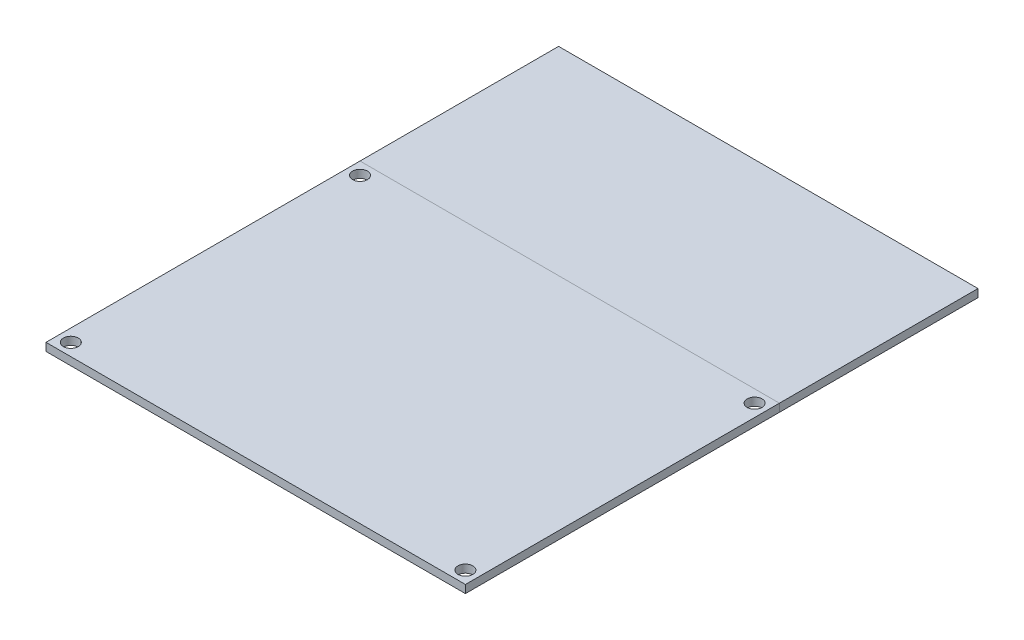
ISO-10303-21;
HEADER;
FILE_DESCRIPTION(('STEP AP214'),'2;1');
FILE_NAME('part.step','',(''),(''),'','','');
FILE_SCHEMA(('AUTOMOTIVE_DESIGN { 1 0 10303 214 1 1 1 1 }'));
ENDSEC;
DATA;
#1=APPLICATION_CONTEXT('core data for automotive mechanical design processes');
#2=APPLICATION_PROTOCOL_DEFINITION('international standard','automotive_design',2000,#1);
#3=PRODUCT_CONTEXT('',#1,'mechanical');
#4=PRODUCT('Part','Part','',(#3));
#5=PRODUCT_RELATED_PRODUCT_CATEGORY('part','',(#4));
#6=PRODUCT_DEFINITION_FORMATION('','',#4);
#7=PRODUCT_DEFINITION_CONTEXT('part definition',#1,'design');
#8=PRODUCT_DEFINITION('design','',#6,#7);
#9=PRODUCT_DEFINITION_SHAPE('','',#8);
#10=(LENGTH_UNIT() NAMED_UNIT(*) SI_UNIT(.MILLI.,.METRE.));
#11=(NAMED_UNIT(*) PLANE_ANGLE_UNIT() SI_UNIT($,.RADIAN.));
#12=(NAMED_UNIT(*) SI_UNIT($,.STERADIAN.) SOLID_ANGLE_UNIT());
#13=UNCERTAINTY_MEASURE_WITH_UNIT(LENGTH_MEASURE(1.E-05),#10,'distance_accuracy_value','');
#14=(GEOMETRIC_REPRESENTATION_CONTEXT(3) GLOBAL_UNCERTAINTY_ASSIGNED_CONTEXT((#13)) GLOBAL_UNIT_ASSIGNED_CONTEXT((#10,
#11,#12)) REPRESENTATION_CONTEXT('',''));
#15=CARTESIAN_POINT('',(0.,0.,0.));
#16=DIRECTION('',(0.,0.,1.));
#17=DIRECTION('',(1.,0.,0.));
#18=AXIS2_PLACEMENT_3D('',#15,#16,#17);
#19=CARTESIAN_POINT('',(-42.2399999999998,1.6,-31.6250000000001));
#20=DIRECTION('',(1.,0.,0.));
#21=DIRECTION('',(0.,0.,-1.));
#22=AXIS2_PLACEMENT_3D('',#19,#20,#21);
#23=PLANE('',#22);
#24=DIRECTION('',(0.,0.,1.));
#25=VECTOR('',#24,1.);
#26=CARTESIAN_POINT('',(-42.2399999999998,0.,-31.6250000000001));
#27=LINE('',#26,#25);
#28=CARTESIAN_POINT('',(-42.2399999999998,0.,-71.6250000000001));
#29=VERTEX_POINT('',#28);
#30=CARTESIAN_POINT('',(-42.2399999999998,0.,-31.6250000000001));
#31=VERTEX_POINT('',#30);
#32=EDGE_CURVE('E106',#29,#31,#27,.T.);
#33=ORIENTED_EDGE('',*,*,#32,.T.);
#34=DIRECTION('',(0.,-1.,0.));
#35=VECTOR('',#34,1.);
#36=CARTESIAN_POINT('',(-42.2399999999998,1.6,-31.6250000000001));
#37=LINE('',#36,#35);
#38=CARTESIAN_POINT('',(-42.2399999999998,1.6,-31.6250000000001));
#39=VERTEX_POINT('',#38);
#40=EDGE_CURVE('E12',#39,#31,#37,.T.);
#41=ORIENTED_EDGE('',*,*,#40,.F.);
#42=DIRECTION('',(0.,0.,1.));
#43=VECTOR('',#42,1.);
#44=CARTESIAN_POINT('',(-42.2399999999998,1.6,-31.6250000000001));
#45=LINE('',#44,#43);
#46=CARTESIAN_POINT('',(-42.2399999999998,1.6,-71.6250000000001));
#47=VERTEX_POINT('',#46);
#48=EDGE_CURVE('E94',#47,#39,#45,.T.);
#49=ORIENTED_EDGE('',*,*,#48,.F.);
#50=DIRECTION('',(0.,-1.,0.));
#51=VECTOR('',#50,1.);
#52=CARTESIAN_POINT('',(-42.2399999999998,1.6,-71.6250000000001));
#53=LINE('',#52,#51);
#54=EDGE_CURVE('E102',#47,#29,#53,.T.);
#55=ORIENTED_EDGE('',*,*,#54,.T.);
#56=EDGE_LOOP('',(#33,#41,#49,#55));
#57=FACE_BOUND('',#56,.T.);
#58=ADVANCED_FACE('F43',(#57),#23,.F.);
#59=CARTESIAN_POINT('',(-42.2399999999998,1.6,-31.6250000000001));
#60=DIRECTION('',(0.,0.,-1.));
#61=DIRECTION('',(-1.,0.,0.));
#62=AXIS2_PLACEMENT_3D('',#59,#60,#61);
#63=PLANE('',#62);
#64=DIRECTION('',(1.,0.,0.));
#65=VECTOR('',#64,1.);
#66=CARTESIAN_POINT('',(-42.2399999999998,0.,-31.6250000000001));
#67=LINE('',#66,#65);
#68=CARTESIAN_POINT('',(42.2400000000002,0.,-31.6250000000001));
#69=VERTEX_POINT('',#68);
#70=EDGE_CURVE('E98',#31,#69,#67,.T.);
#71=ORIENTED_EDGE('',*,*,#70,.T.);
#72=DIRECTION('',(0.,-1.,0.));
#73=VECTOR('',#72,1.);
#74=CARTESIAN_POINT('',(42.2400000000002,1.6,-31.6250000000001));
#75=LINE('',#74,#73);
#76=CARTESIAN_POINT('',(42.2400000000002,1.6,-31.6250000000001));
#77=VERTEX_POINT('',#76);
#78=EDGE_CURVE('E51',#77,#69,#75,.T.);
#79=ORIENTED_EDGE('',*,*,#78,.F.);
#80=DIRECTION('',(1.,0.,0.));
#81=VECTOR('',#80,1.);
#82=CARTESIAN_POINT('',(-42.2399999999998,1.6,-31.6250000000001));
#83=LINE('',#82,#81);
#84=EDGE_CURVE('E89',#39,#77,#83,.T.);
#85=ORIENTED_EDGE('',*,*,#84,.F.);
#86=ORIENTED_EDGE('',*,*,#40,.T.);
#87=EDGE_LOOP('',(#71,#79,#85,#86));
#88=FACE_BOUND('',#87,.T.);
#89=ADVANCED_FACE('F97',(#88),#63,.F.);
#90=CARTESIAN_POINT('',(42.2400000000002,1.6,-31.6250000000001));
#91=DIRECTION('',(-1.,0.,0.));
#92=DIRECTION('',(0.,0.,1.));
#93=AXIS2_PLACEMENT_3D('',#90,#91,#92);
#94=PLANE('',#93);
#95=DIRECTION('',(0.,0.,-1.));
#96=VECTOR('',#95,1.);
#97=CARTESIAN_POINT('',(42.2400000000002,0.,-31.6250000000001));
#98=LINE('',#97,#96);
#99=CARTESIAN_POINT('',(42.2400000000002,0.,-71.6250000000001));
#100=VERTEX_POINT('',#99);
#101=EDGE_CURVE('E76',#69,#100,#98,.T.);
#102=ORIENTED_EDGE('',*,*,#101,.T.);
#103=DIRECTION('',(0.,-1.,0.));
#104=VECTOR('',#103,1.);
#105=CARTESIAN_POINT('',(42.2400000000002,1.6,-71.6250000000001));
#106=LINE('',#105,#104);
#107=CARTESIAN_POINT('',(42.2400000000002,1.6,-71.6250000000001));
#108=VERTEX_POINT('',#107);
#109=EDGE_CURVE('E99',#108,#100,#106,.T.);
#110=ORIENTED_EDGE('',*,*,#109,.F.);
#111=DIRECTION('',(0.,0.,-1.));
#112=VECTOR('',#111,1.);
#113=CARTESIAN_POINT('',(42.2400000000002,1.6,-31.6250000000001));
#114=LINE('',#113,#112);
#115=EDGE_CURVE('E92',#77,#108,#114,.T.);
#116=ORIENTED_EDGE('',*,*,#115,.F.);
#117=ORIENTED_EDGE('',*,*,#78,.T.);
#118=EDGE_LOOP('',(#102,#110,#116,#117));
#119=FACE_BOUND('',#118,.T.);
#120=ADVANCED_FACE('F100',(#119),#94,.F.);
#121=CARTESIAN_POINT('',(-42.2399999999998,1.6,-71.6250000000001));
#122=DIRECTION('',(0.,0.,1.));
#123=DIRECTION('',(1.,0.,0.));
#124=AXIS2_PLACEMENT_3D('',#121,#122,#123);
#125=PLANE('',#124);
#126=DIRECTION('',(-1.,0.,0.));
#127=VECTOR('',#126,1.);
#128=CARTESIAN_POINT('',(-42.2399999999998,0.,-71.6250000000001));
#129=LINE('',#128,#127);
#130=EDGE_CURVE('E82',#100,#29,#129,.T.);
#131=ORIENTED_EDGE('',*,*,#130,.T.);
#132=ORIENTED_EDGE('',*,*,#54,.F.);
#133=DIRECTION('',(-1.,0.,0.));
#134=VECTOR('',#133,1.);
#135=CARTESIAN_POINT('',(-42.2399999999998,1.6,-71.6250000000001));
#136=LINE('',#135,#134);
#137=EDGE_CURVE('E59',#108,#47,#136,.T.);
#138=ORIENTED_EDGE('',*,*,#137,.F.);
#139=ORIENTED_EDGE('',*,*,#109,.T.);
#140=EDGE_LOOP('',(#131,#132,#138,#139));
#141=FACE_BOUND('',#140,.T.);
#142=ADVANCED_FACE('F113',(#141),#125,.F.);
#143=CARTESIAN_POINT('',(0.,1.6,0.));
#144=DIRECTION('',(0.,-1.,0.));
#145=DIRECTION('',(0.,0.,-1.));
#146=AXIS2_PLACEMENT_3D('',#143,#144,#145);
#147=PLANE('',#146);
#148=ORIENTED_EDGE('',*,*,#48,.T.);
#149=ORIENTED_EDGE('',*,*,#84,.T.);
#150=ORIENTED_EDGE('',*,*,#115,.T.);
#151=ORIENTED_EDGE('',*,*,#137,.T.);
#152=EDGE_LOOP('',(#148,#149,#150,#151));
#153=FACE_BOUND('',#152,.T.);
#154=ADVANCED_FACE('F90',(#153),#147,.F.);
#155=CARTESIAN_POINT('',(0.,0.,0.));
#156=DIRECTION('',(0.,-1.,0.));
#157=DIRECTION('',(0.,0.,-1.));
#158=AXIS2_PLACEMENT_3D('',#155,#156,#157);
#159=PLANE('',#158);
#160=ORIENTED_EDGE('',*,*,#32,.F.);
#161=ORIENTED_EDGE('',*,*,#130,.F.);
#162=ORIENTED_EDGE('',*,*,#101,.F.);
#163=ORIENTED_EDGE('',*,*,#70,.F.);
#164=EDGE_LOOP('',(#160,#161,#162,#163));
#165=FACE_BOUND('',#164,.T.);
#166=ADVANCED_FACE('F116',(#165),#159,.T.);
#167=CLOSED_SHELL('',(#58,#89,#120,#142,#154,#166));
#168=MANIFOLD_SOLID_BREP('B2',#167);
#169=CARTESIAN_POINT('',(0.,1.6,0.));
#170=DIRECTION('',(0.,-1.,0.));
#171=DIRECTION('',(0.,0.,-1.));
#172=AXIS2_PLACEMENT_3D('',#169,#170,#171);
#173=PLANE('',#172);
#174=DIRECTION('',(0.,0.,-1.));
#175=VECTOR('',#174,1.);
#176=CARTESIAN_POINT('',(42.2400000000002,1.6,31.625));
#177=LINE('',#176,#175);
#178=CARTESIAN_POINT('',(42.2400000000002,1.6,31.625));
#179=VERTEX_POINT('',#178);
#180=CARTESIAN_POINT('',(42.2400000000002,1.6,-31.6250000000001));
#181=VERTEX_POINT('',#180);
#182=EDGE_CURVE('E219',#179,#181,#177,.T.);
#183=ORIENTED_EDGE('',*,*,#182,.T.);
#184=DIRECTION('',(-1.,0.,0.));
#185=VECTOR('',#184,1.);
#186=CARTESIAN_POINT('',(-42.2399999999998,1.6,-31.6250000000001));
#187=LINE('',#186,#185);
#188=CARTESIAN_POINT('',(-42.2399999999998,1.6,-31.6250000000001));
#189=VERTEX_POINT('',#188);
#190=EDGE_CURVE('E214',#181,#189,#187,.T.);
#191=ORIENTED_EDGE('',*,*,#190,.T.);
#192=DIRECTION('',(0.,0.,1.));
#193=VECTOR('',#192,1.);
#194=CARTESIAN_POINT('',(-42.2399999999998,1.6,31.625));
#195=LINE('',#194,#193);
#196=CARTESIAN_POINT('',(-42.2399999999998,1.6,31.625));
#197=VERTEX_POINT('',#196);
#198=EDGE_CURVE('E217',#189,#197,#195,.T.);
#199=ORIENTED_EDGE('',*,*,#198,.T.);
#200=DIRECTION('',(1.,0.,0.));
#201=VECTOR('',#200,1.);
#202=CARTESIAN_POINT('',(-42.2399999999998,1.6,31.625));
#203=LINE('',#202,#201);
#204=EDGE_CURVE('E184',#197,#179,#203,.T.);
#205=ORIENTED_EDGE('',*,*,#204,.T.);
#206=EDGE_LOOP('',(#183,#191,#199,#205));
#207=FACE_BOUND('',#206,.T.);
#208=CARTESIAN_POINT('',(-39.7399999999998,1.6,-29.1250000000001));
#209=DIRECTION('',(0.,1.,0.));
#210=DIRECTION('',(0.,0.,1.));
#211=AXIS2_PLACEMENT_3D('',#208,#209,#210);
#212=CIRCLE('',#211,1.5);
#213=CARTESIAN_POINT('',(-39.7399999999998,1.6,-27.6250000000001));
#214=VERTEX_POINT('',#213);
#215=EDGE_CURVE('E234',#214,#214,#212,.T.);
#216=ORIENTED_EDGE('',*,*,#215,.F.);
#217=EDGE_LOOP('',(#216));
#218=FACE_BOUND('',#217,.T.);
#219=CARTESIAN_POINT('',(-39.7399999999998,1.6,29.1250000000001));
#220=DIRECTION('',(0.,1.,0.));
#221=DIRECTION('',(0.,0.,-1.));
#222=AXIS2_PLACEMENT_3D('',#219,#220,#221);
#223=CIRCLE('',#222,1.5);
#224=CARTESIAN_POINT('',(-39.7399999999998,1.6,27.6250000000001));
#225=VERTEX_POINT('',#224);
#226=EDGE_CURVE('E249',#225,#225,#223,.T.);
#227=ORIENTED_EDGE('',*,*,#226,.F.);
#228=EDGE_LOOP('',(#227));
#229=FACE_BOUND('',#228,.T.);
#230=CARTESIAN_POINT('',(39.7399999999998,1.6,29.1250000000001));
#231=DIRECTION('',(0.,1.,0.));
#232=DIRECTION('',(0.,0.,1.));
#233=AXIS2_PLACEMENT_3D('',#230,#231,#232);
#234=CIRCLE('',#233,1.5);
#235=CARTESIAN_POINT('',(39.7399999999998,1.6,30.6250000000001));
#236=VERTEX_POINT('',#235);
#237=EDGE_CURVE('E255',#236,#236,#234,.T.);
#238=ORIENTED_EDGE('',*,*,#237,.F.);
#239=EDGE_LOOP('',(#238));
#240=FACE_BOUND('',#239,.T.);
#241=CARTESIAN_POINT('',(39.7399999999998,1.6,-29.1250000000001));
#242=DIRECTION('',(0.,1.,0.));
#243=DIRECTION('',(0.,0.,-1.));
#244=AXIS2_PLACEMENT_3D('',#241,#242,#243);
#245=CIRCLE('',#244,1.5);
#246=CARTESIAN_POINT('',(39.7399999999998,1.6,-30.6250000000001));
#247=VERTEX_POINT('',#246);
#248=EDGE_CURVE('E261',#247,#247,#245,.T.);
#249=ORIENTED_EDGE('',*,*,#248,.F.);
#250=EDGE_LOOP('',(#249));
#251=FACE_BOUND('',#250,.T.);
#252=ADVANCED_FACE('F167',(#207,#218,#229,#240,#251),#173,.F.);
#253=CARTESIAN_POINT('',(0.,0.,0.));
#254=DIRECTION('',(0.,-1.,0.));
#255=DIRECTION('',(0.,0.,-1.));
#256=AXIS2_PLACEMENT_3D('',#253,#254,#255);
#257=PLANE('',#256);
#258=CARTESIAN_POINT('',(39.7399999999998,0.,29.1250000000001));
#259=DIRECTION('',(0.,1.,0.));
#260=DIRECTION('',(0.,0.,1.));
#261=AXIS2_PLACEMENT_3D('',#258,#259,#260);
#262=CIRCLE('',#261,1.5);
#263=CARTESIAN_POINT('',(39.7399999999998,0.,30.6250000000001));
#264=VERTEX_POINT('',#263);
#265=EDGE_CURVE('E258',#264,#264,#262,.T.);
#266=ORIENTED_EDGE('',*,*,#265,.T.);
#267=EDGE_LOOP('',(#266));
#268=FACE_BOUND('',#267,.T.);
#269=CARTESIAN_POINT('',(-39.7399999999998,0.,-29.1250000000001));
#270=DIRECTION('',(0.,1.,0.));
#271=DIRECTION('',(0.,0.,1.));
#272=AXIS2_PLACEMENT_3D('',#269,#270,#271);
#273=CIRCLE('',#272,1.5);
#274=CARTESIAN_POINT('',(-39.7399999999998,0.,-27.6250000000001));
#275=VERTEX_POINT('',#274);
#276=EDGE_CURVE('E246',#275,#275,#273,.T.);
#277=ORIENTED_EDGE('',*,*,#276,.T.);
#278=EDGE_LOOP('',(#277));
#279=FACE_BOUND('',#278,.T.);
#280=DIRECTION('',(0.,0.,-1.));
#281=VECTOR('',#280,1.);
#282=CARTESIAN_POINT('',(42.2400000000002,0.,31.625));
#283=LINE('',#282,#281);
#284=CARTESIAN_POINT('',(42.2400000000002,0.,31.625));
#285=VERTEX_POINT('',#284);
#286=CARTESIAN_POINT('',(42.2400000000002,0.,-31.6250000000001));
#287=VERTEX_POINT('',#286);
#288=EDGE_CURVE('E231',#285,#287,#283,.T.);
#289=ORIENTED_EDGE('',*,*,#288,.F.);
#290=DIRECTION('',(1.,0.,0.));
#291=VECTOR('',#290,1.);
#292=CARTESIAN_POINT('',(-42.2399999999998,0.,31.625));
#293=LINE('',#292,#291);
#294=CARTESIAN_POINT('',(-42.2399999999998,0.,31.625));
#295=VERTEX_POINT('',#294);
#296=EDGE_CURVE('E207',#295,#285,#293,.T.);
#297=ORIENTED_EDGE('',*,*,#296,.F.);
#298=DIRECTION('',(0.,0.,1.));
#299=VECTOR('',#298,1.);
#300=CARTESIAN_POINT('',(-42.2399999999998,0.,31.625));
#301=LINE('',#300,#299);
#302=CARTESIAN_POINT('',(-42.2399999999998,0.,-31.6250000000001));
#303=VERTEX_POINT('',#302);
#304=EDGE_CURVE('E201',#303,#295,#301,.T.);
#305=ORIENTED_EDGE('',*,*,#304,.F.);
#306=DIRECTION('',(-1.,0.,0.));
#307=VECTOR('',#306,1.);
#308=CARTESIAN_POINT('',(-42.2399999999998,0.,-31.6250000000001));
#309=LINE('',#308,#307);
#310=EDGE_CURVE('E223',#287,#303,#309,.T.);
#311=ORIENTED_EDGE('',*,*,#310,.F.);
#312=EDGE_LOOP('',(#289,#297,#305,#311));
#313=FACE_BOUND('',#312,.T.);
#314=CARTESIAN_POINT('',(-39.7399999999998,0.,29.1250000000001));
#315=DIRECTION('',(0.,1.,0.));
#316=DIRECTION('',(0.,0.,-1.));
#317=AXIS2_PLACEMENT_3D('',#314,#315,#316);
#318=CIRCLE('',#317,1.5);
#319=CARTESIAN_POINT('',(-39.7399999999998,0.,27.6250000000001));
#320=VERTEX_POINT('',#319);
#321=EDGE_CURVE('E252',#320,#320,#318,.T.);
#322=ORIENTED_EDGE('',*,*,#321,.T.);
#323=EDGE_LOOP('',(#322));
#324=FACE_BOUND('',#323,.T.);
#325=CARTESIAN_POINT('',(39.7399999999998,0.,-29.1250000000001));
#326=DIRECTION('',(0.,1.,0.));
#327=DIRECTION('',(0.,0.,-1.));
#328=AXIS2_PLACEMENT_3D('',#325,#326,#327);
#329=CIRCLE('',#328,1.5);
#330=CARTESIAN_POINT('',(39.7399999999998,0.,-30.6250000000001));
#331=VERTEX_POINT('',#330);
#332=EDGE_CURVE('E264',#331,#331,#329,.T.);
#333=ORIENTED_EDGE('',*,*,#332,.T.);
#334=EDGE_LOOP('',(#333));
#335=FACE_BOUND('',#334,.T.);
#336=ADVANCED_FACE('F242',(#268,#279,#313,#324,#335),#257,.T.);
#337=CARTESIAN_POINT('',(42.2400000000002,1.6,31.625));
#338=DIRECTION('',(-1.,0.,0.));
#339=DIRECTION('',(0.,0.,1.));
#340=AXIS2_PLACEMENT_3D('',#337,#338,#339);
#341=PLANE('',#340);
#342=ORIENTED_EDGE('',*,*,#288,.T.);
#343=DIRECTION('',(0.,-1.,0.));
#344=VECTOR('',#343,1.);
#345=CARTESIAN_POINT('',(42.2400000000002,1.6,-31.6250000000001));
#346=LINE('',#345,#344);
#347=EDGE_CURVE('E41',#181,#287,#346,.T.);
#348=ORIENTED_EDGE('',*,*,#347,.F.);
#349=ORIENTED_EDGE('',*,*,#182,.F.);
#350=DIRECTION('',(0.,-1.,0.));
#351=VECTOR('',#350,1.);
#352=CARTESIAN_POINT('',(42.2400000000002,1.6,31.625));
#353=LINE('',#352,#351);
#354=EDGE_CURVE('E227',#179,#285,#353,.T.);
#355=ORIENTED_EDGE('',*,*,#354,.T.);
#356=EDGE_LOOP('',(#342,#348,#349,#355));
#357=FACE_BOUND('',#356,.T.);
#358=ADVANCED_FACE('F169',(#357),#341,.F.);
#359=CARTESIAN_POINT('',(-42.2399999999998,1.6,-31.6250000000001));
#360=DIRECTION('',(0.,0.,1.));
#361=DIRECTION('',(1.,0.,0.));
#362=AXIS2_PLACEMENT_3D('',#359,#360,#361);
#363=PLANE('',#362);
#364=ORIENTED_EDGE('',*,*,#310,.T.);
#365=DIRECTION('',(0.,-1.,0.));
#366=VECTOR('',#365,1.);
#367=CARTESIAN_POINT('',(-42.2399999999998,1.6,-31.6250000000001));
#368=LINE('',#367,#366);
#369=EDGE_CURVE('E176',#189,#303,#368,.T.);
#370=ORIENTED_EDGE('',*,*,#369,.F.);
#371=ORIENTED_EDGE('',*,*,#190,.F.);
#372=ORIENTED_EDGE('',*,*,#347,.T.);
#373=EDGE_LOOP('',(#364,#370,#371,#372));
#374=FACE_BOUND('',#373,.T.);
#375=ADVANCED_FACE('F222',(#374),#363,.F.);
#376=CARTESIAN_POINT('',(-42.2399999999998,1.6,31.625));
#377=DIRECTION('',(1.,0.,0.));
#378=DIRECTION('',(0.,0.,-1.));
#379=AXIS2_PLACEMENT_3D('',#376,#377,#378);
#380=PLANE('',#379);
#381=ORIENTED_EDGE('',*,*,#304,.T.);
#382=DIRECTION('',(0.,-1.,0.));
#383=VECTOR('',#382,1.);
#384=CARTESIAN_POINT('',(-42.2399999999998,1.6,31.625));
#385=LINE('',#384,#383);
#386=EDGE_CURVE('E224',#197,#295,#385,.T.);
#387=ORIENTED_EDGE('',*,*,#386,.F.);
#388=ORIENTED_EDGE('',*,*,#198,.F.);
#389=ORIENTED_EDGE('',*,*,#369,.T.);
#390=EDGE_LOOP('',(#381,#387,#388,#389));
#391=FACE_BOUND('',#390,.T.);
#392=ADVANCED_FACE('F225',(#391),#380,.F.);
#393=CARTESIAN_POINT('',(-42.2399999999998,1.6,31.625));
#394=DIRECTION('',(0.,0.,-1.));
#395=DIRECTION('',(-1.,0.,0.));
#396=AXIS2_PLACEMENT_3D('',#393,#394,#395);
#397=PLANE('',#396);
#398=ORIENTED_EDGE('',*,*,#296,.T.);
#399=ORIENTED_EDGE('',*,*,#354,.F.);
#400=ORIENTED_EDGE('',*,*,#204,.F.);
#401=ORIENTED_EDGE('',*,*,#386,.T.);
#402=EDGE_LOOP('',(#398,#399,#400,#401));
#403=FACE_BOUND('',#402,.T.);
#404=ADVANCED_FACE('F239',(#403),#397,.F.);
#405=CARTESIAN_POINT('',(-39.7399999999998,1.6,-29.1250000000001));
#406=DIRECTION('',(0.,-1.,0.));
#407=DIRECTION('',(0.,0.,-1.));
#408=AXIS2_PLACEMENT_3D('',#405,#406,#407);
#409=CYLINDRICAL_SURFACE('',#408,1.5);
#410=ORIENTED_EDGE('',*,*,#215,.T.);
#411=EDGE_LOOP('',(#410));
#412=FACE_BOUND('',#411,.T.);
#413=ORIENTED_EDGE('',*,*,#276,.F.);
#414=EDGE_LOOP('',(#413));
#415=FACE_BOUND('',#414,.T.);
#416=ADVANCED_FACE('F281',(#412,#415),#409,.F.);
#417=CARTESIAN_POINT('',(-39.7399999999998,1.6,29.1250000000001));
#418=DIRECTION('',(0.,-1.,0.));
#419=DIRECTION('',(0.,0.,-1.));
#420=AXIS2_PLACEMENT_3D('',#417,#418,#419);
#421=CYLINDRICAL_SURFACE('',#420,1.5);
#422=ORIENTED_EDGE('',*,*,#226,.T.);
#423=EDGE_LOOP('',(#422));
#424=FACE_BOUND('',#423,.T.);
#425=ORIENTED_EDGE('',*,*,#321,.F.);
#426=EDGE_LOOP('',(#425));
#427=FACE_BOUND('',#426,.T.);
#428=ADVANCED_FACE('F327',(#424,#427),#421,.F.);
#429=CARTESIAN_POINT('',(39.7399999999998,1.6,29.1250000000001));
#430=DIRECTION('',(0.,-1.,0.));
#431=DIRECTION('',(0.,0.,-1.));
#432=AXIS2_PLACEMENT_3D('',#429,#430,#431);
#433=CYLINDRICAL_SURFACE('',#432,1.5);
#434=ORIENTED_EDGE('',*,*,#237,.T.);
#435=EDGE_LOOP('',(#434));
#436=FACE_BOUND('',#435,.T.);
#437=ORIENTED_EDGE('',*,*,#265,.F.);
#438=EDGE_LOOP('',(#437));
#439=FACE_BOUND('',#438,.T.);
#440=ADVANCED_FACE('F335',(#436,#439),#433,.F.);
#441=CARTESIAN_POINT('',(39.7399999999998,1.6,-29.1250000000001));
#442=DIRECTION('',(0.,-1.,0.));
#443=DIRECTION('',(0.,0.,-1.));
#444=AXIS2_PLACEMENT_3D('',#441,#442,#443);
#445=CYLINDRICAL_SURFACE('',#444,1.5);
#446=ORIENTED_EDGE('',*,*,#248,.T.);
#447=EDGE_LOOP('',(#446));
#448=FACE_BOUND('',#447,.T.);
#449=ORIENTED_EDGE('',*,*,#332,.F.);
#450=EDGE_LOOP('',(#449));
#451=FACE_BOUND('',#450,.T.);
#452=ADVANCED_FACE('F270',(#448,#451),#445,.F.);
#453=CLOSED_SHELL('',(#252,#336,#358,#375,#392,#404,#416,#428,#440,#452));
#454=MANIFOLD_SOLID_BREP('B6',#453);
#455=ADVANCED_BREP_SHAPE_REPRESENTATION('',(#18,#168,#454),#14);
#456=SHAPE_DEFINITION_REPRESENTATION(#9,#455);
ENDSEC;
END-ISO-10303-21;
